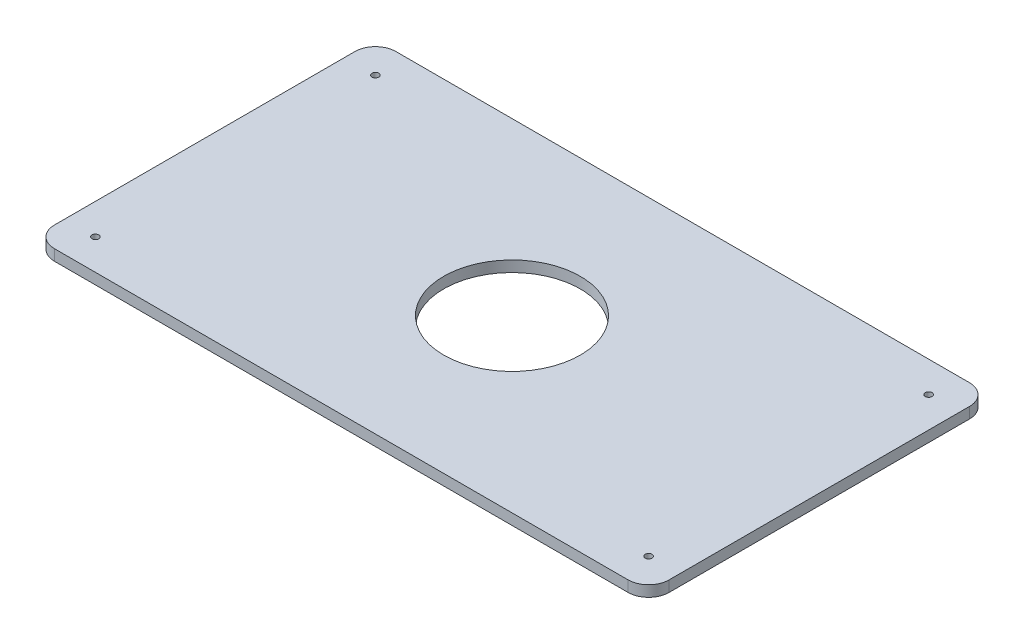
ISO-10303-21;
HEADER;
FILE_DESCRIPTION(('STEP AP214'),'2;1');
FILE_NAME('part.step','',(''),(''),'','','');
FILE_SCHEMA(('AUTOMOTIVE_DESIGN { 1 0 10303 214 1 1 1 1 }'));
ENDSEC;
DATA;
#1=APPLICATION_CONTEXT('core data for automotive mechanical design processes');
#2=APPLICATION_PROTOCOL_DEFINITION('international standard','automotive_design',2000,#1);
#3=PRODUCT_CONTEXT('',#1,'mechanical');
#4=PRODUCT('Part','Part','',(#3));
#5=PRODUCT_RELATED_PRODUCT_CATEGORY('part','',(#4));
#6=PRODUCT_DEFINITION_FORMATION('','',#4);
#7=PRODUCT_DEFINITION_CONTEXT('part definition',#1,'design');
#8=PRODUCT_DEFINITION('design','',#6,#7);
#9=PRODUCT_DEFINITION_SHAPE('','',#8);
#10=(LENGTH_UNIT() NAMED_UNIT(*) SI_UNIT(.MILLI.,.METRE.));
#11=(NAMED_UNIT(*) PLANE_ANGLE_UNIT() SI_UNIT($,.RADIAN.));
#12=(NAMED_UNIT(*) SI_UNIT($,.STERADIAN.) SOLID_ANGLE_UNIT());
#13=UNCERTAINTY_MEASURE_WITH_UNIT(LENGTH_MEASURE(1.E-05),#10,'distance_accuracy_value','');
#14=(GEOMETRIC_REPRESENTATION_CONTEXT(3) GLOBAL_UNCERTAINTY_ASSIGNED_CONTEXT((#13)) GLOBAL_UNIT_ASSIGNED_CONTEXT((#10,
#11,#12)) REPRESENTATION_CONTEXT('',''));
#15=CARTESIAN_POINT('',(0.,0.,0.));
#16=DIRECTION('',(0.,0.,1.));
#17=DIRECTION('',(1.,0.,0.));
#18=AXIS2_PLACEMENT_3D('',#15,#16,#17);
#19=CARTESIAN_POINT('',(15.,8.,-15.));
#20=DIRECTION('',(0.,-1.,0.));
#21=DIRECTION('',(0.,0.,-1.));
#22=AXIS2_PLACEMENT_3D('',#19,#20,#21);
#23=PLANE('',#22);
#24=CARTESIAN_POINT('',(15.,8.,-15.));
#25=DIRECTION('',(0.,1.,0.));
#26=DIRECTION('',(0.,0.,-1.));
#27=AXIS2_PLACEMENT_3D('',#24,#25,#26);
#28=CIRCLE('',#27,15.);
#29=CARTESIAN_POINT('',(0.,8.,-15.0000000000001));
#30=VERTEX_POINT('',#29);
#31=CARTESIAN_POINT('',(15.0000000000001,8.,0.));
#32=VERTEX_POINT('',#31);
#33=EDGE_CURVE('E145',#30,#32,#28,.T.);
#34=ORIENTED_EDGE('',*,*,#33,.T.);
#35=DIRECTION('',(1.,0.,0.));
#36=VECTOR('',#35,1.);
#37=CARTESIAN_POINT('',(15.0000000000001,8.,0.));
#38=LINE('',#37,#36);
#39=CARTESIAN_POINT('',(435.,8.,0.));
#40=VERTEX_POINT('',#39);
#41=EDGE_CURVE('E93',#32,#40,#38,.T.);
#42=ORIENTED_EDGE('',*,*,#41,.T.);
#43=CARTESIAN_POINT('',(435.,8.,-15.));
#44=DIRECTION('',(0.,1.,0.));
#45=DIRECTION('',(0.,0.,1.));
#46=AXIS2_PLACEMENT_3D('',#43,#44,#45);
#47=CIRCLE('',#46,15.);
#48=CARTESIAN_POINT('',(450.,8.,-15.0000000000001));
#49=VERTEX_POINT('',#48);
#50=EDGE_CURVE('E160',#40,#49,#47,.T.);
#51=ORIENTED_EDGE('',*,*,#50,.T.);
#52=DIRECTION('',(0.,0.,-1.));
#53=VECTOR('',#52,1.);
#54=CARTESIAN_POINT('',(450.,8.,-15.0000000000001));
#55=LINE('',#54,#53);
#56=CARTESIAN_POINT('',(450.,8.,-235.));
#57=VERTEX_POINT('',#56);
#58=EDGE_CURVE('E173',#49,#57,#55,.T.);
#59=ORIENTED_EDGE('',*,*,#58,.T.);
#60=CARTESIAN_POINT('',(435.,8.,-235.));
#61=DIRECTION('',(0.,1.,0.));
#62=DIRECTION('',(0.,0.,-1.));
#63=AXIS2_PLACEMENT_3D('',#60,#61,#62);
#64=CIRCLE('',#63,15.);
#65=CARTESIAN_POINT('',(435.,8.,-250.));
#66=VERTEX_POINT('',#65);
#67=EDGE_CURVE('E112',#57,#66,#64,.T.);
#68=ORIENTED_EDGE('',*,*,#67,.T.);
#69=DIRECTION('',(-1.,0.,0.));
#70=VECTOR('',#69,1.);
#71=CARTESIAN_POINT('',(15.0000000000001,8.,-250.));
#72=LINE('',#71,#70);
#73=CARTESIAN_POINT('',(15.0000000000001,8.,-250.));
#74=VERTEX_POINT('',#73);
#75=EDGE_CURVE('E106',#66,#74,#72,.T.);
#76=ORIENTED_EDGE('',*,*,#75,.T.);
#77=CARTESIAN_POINT('',(15.,8.,-235.));
#78=DIRECTION('',(0.,1.,0.));
#79=DIRECTION('',(0.,0.,-1.));
#80=AXIS2_PLACEMENT_3D('',#77,#78,#79);
#81=CIRCLE('',#80,15.);
#82=CARTESIAN_POINT('',(0.,8.,-235.));
#83=VERTEX_POINT('',#82);
#84=EDGE_CURVE('E110',#74,#83,#81,.T.);
#85=ORIENTED_EDGE('',*,*,#84,.T.);
#86=DIRECTION('',(0.,0.,1.));
#87=VECTOR('',#86,1.);
#88=CARTESIAN_POINT('',(0.,8.,-15.0000000000001));
#89=LINE('',#88,#87);
#90=EDGE_CURVE('E50',#83,#30,#89,.T.);
#91=ORIENTED_EDGE('',*,*,#90,.T.);
#92=EDGE_LOOP('',(#34,#42,#51,#59,#68,#76,#85,#91));
#93=FACE_BOUND('',#92,.T.);
#94=CARTESIAN_POINT('',(225.,8.,-125.));
#95=DIRECTION('',(0.,1.,0.));
#96=DIRECTION('',(0.,0.,1.));
#97=AXIS2_PLACEMENT_3D('',#94,#95,#96);
#98=CIRCLE('',#97,50.);
#99=CARTESIAN_POINT('',(225.,8.,-75.));
#100=VERTEX_POINT('',#99);
#101=EDGE_CURVE('E134',#100,#100,#98,.T.);
#102=ORIENTED_EDGE('',*,*,#101,.F.);
#103=EDGE_LOOP('',(#102));
#104=FACE_BOUND('',#103,.T.);
#105=CARTESIAN_POINT('',(22.5000000000002,8.,-227.5));
#106=DIRECTION('',(0.,1.,0.));
#107=DIRECTION('',(0.,0.,1.));
#108=AXIS2_PLACEMENT_3D('',#105,#106,#107);
#109=CIRCLE('',#108,2.5);
#110=CARTESIAN_POINT('',(22.5000000000002,8.,-225.));
#111=VERTEX_POINT('',#110);
#112=EDGE_CURVE('E182',#111,#111,#109,.T.);
#113=ORIENTED_EDGE('',*,*,#112,.F.);
#114=EDGE_LOOP('',(#113));
#115=FACE_BOUND('',#114,.T.);
#116=CARTESIAN_POINT('',(427.5,8.,-227.5));
#117=DIRECTION('',(0.,1.,0.));
#118=DIRECTION('',(0.,0.,1.));
#119=AXIS2_PLACEMENT_3D('',#116,#117,#118);
#120=CIRCLE('',#119,2.50000000000002);
#121=CARTESIAN_POINT('',(427.5,8.,-225.));
#122=VERTEX_POINT('',#121);
#123=EDGE_CURVE('E188',#122,#122,#120,.T.);
#124=ORIENTED_EDGE('',*,*,#123,.F.);
#125=EDGE_LOOP('',(#124));
#126=FACE_BOUND('',#125,.T.);
#127=CARTESIAN_POINT('',(427.5,8.,-22.5));
#128=DIRECTION('',(0.,1.,0.));
#129=DIRECTION('',(0.,0.,1.));
#130=AXIS2_PLACEMENT_3D('',#127,#128,#129);
#131=CIRCLE('',#130,2.50000000000002);
#132=CARTESIAN_POINT('',(427.5,8.,-20.));
#133=VERTEX_POINT('',#132);
#134=EDGE_CURVE('E194',#133,#133,#131,.T.);
#135=ORIENTED_EDGE('',*,*,#134,.F.);
#136=EDGE_LOOP('',(#135));
#137=FACE_BOUND('',#136,.T.);
#138=CARTESIAN_POINT('',(22.5000000000002,8.,-22.5));
#139=DIRECTION('',(0.,1.,0.));
#140=DIRECTION('',(0.,0.,1.));
#141=AXIS2_PLACEMENT_3D('',#138,#139,#140);
#142=CIRCLE('',#141,2.5);
#143=CARTESIAN_POINT('',(22.5000000000002,8.,-20.));
#144=VERTEX_POINT('',#143);
#145=EDGE_CURVE('E200',#144,#144,#142,.T.);
#146=ORIENTED_EDGE('',*,*,#145,.F.);
#147=EDGE_LOOP('',(#146));
#148=FACE_BOUND('',#147,.T.);
#149=ADVANCED_FACE('F33',(#93,#104,#115,#126,#137,#148),#23,.F.);
#150=CARTESIAN_POINT('',(15.,0.,-15.));
#151=DIRECTION('',(0.,-1.,0.));
#152=DIRECTION('',(0.,0.,-1.));
#153=AXIS2_PLACEMENT_3D('',#150,#151,#152);
#154=PLANE('',#153);
#155=CARTESIAN_POINT('',(427.5,0.,-22.5));
#156=DIRECTION('',(0.,1.,0.));
#157=DIRECTION('',(0.,0.,1.));
#158=AXIS2_PLACEMENT_3D('',#155,#156,#157);
#159=CIRCLE('',#158,2.50000000000002);
#160=CARTESIAN_POINT('',(427.5,0.,-20.));
#161=VERTEX_POINT('',#160);
#162=EDGE_CURVE('E197',#161,#161,#159,.T.);
#163=ORIENTED_EDGE('',*,*,#162,.T.);
#164=EDGE_LOOP('',(#163));
#165=FACE_BOUND('',#164,.T.);
#166=CARTESIAN_POINT('',(22.5000000000002,0.,-227.5));
#167=DIRECTION('',(0.,1.,0.));
#168=DIRECTION('',(0.,0.,1.));
#169=AXIS2_PLACEMENT_3D('',#166,#167,#168);
#170=CIRCLE('',#169,2.5);
#171=CARTESIAN_POINT('',(22.5000000000002,0.,-225.));
#172=VERTEX_POINT('',#171);
#173=EDGE_CURVE('E185',#172,#172,#170,.T.);
#174=ORIENTED_EDGE('',*,*,#173,.T.);
#175=EDGE_LOOP('',(#174));
#176=FACE_BOUND('',#175,.T.);
#177=CARTESIAN_POINT('',(15.,0.,-15.));
#178=DIRECTION('',(0.,1.,0.));
#179=DIRECTION('',(0.,0.,-1.));
#180=AXIS2_PLACEMENT_3D('',#177,#178,#179);
#181=CIRCLE('',#180,15.);
#182=CARTESIAN_POINT('',(0.,0.,-15.0000000000001));
#183=VERTEX_POINT('',#182);
#184=CARTESIAN_POINT('',(15.0000000000001,0.,0.));
#185=VERTEX_POINT('',#184);
#186=EDGE_CURVE('E130',#183,#185,#181,.T.);
#187=ORIENTED_EDGE('',*,*,#186,.F.);
#188=DIRECTION('',(0.,0.,1.));
#189=VECTOR('',#188,1.);
#190=CARTESIAN_POINT('',(0.,0.,-15.0000000000001));
#191=LINE('',#190,#189);
#192=CARTESIAN_POINT('',(0.,0.,-235.));
#193=VERTEX_POINT('',#192);
#194=EDGE_CURVE('E85',#193,#183,#191,.T.);
#195=ORIENTED_EDGE('',*,*,#194,.F.);
#196=CARTESIAN_POINT('',(15.,0.,-235.));
#197=DIRECTION('',(0.,1.,0.));
#198=DIRECTION('',(0.,0.,-1.));
#199=AXIS2_PLACEMENT_3D('',#196,#197,#198);
#200=CIRCLE('',#199,15.);
#201=CARTESIAN_POINT('',(15.0000000000001,0.,-250.));
#202=VERTEX_POINT('',#201);
#203=EDGE_CURVE('E79',#202,#193,#200,.T.);
#204=ORIENTED_EDGE('',*,*,#203,.F.);
#205=DIRECTION('',(-1.,0.,0.));
#206=VECTOR('',#205,1.);
#207=CARTESIAN_POINT('',(15.0000000000001,0.,-250.));
#208=LINE('',#207,#206);
#209=CARTESIAN_POINT('',(435.,0.,-250.));
#210=VERTEX_POINT('',#209);
#211=EDGE_CURVE('E120',#210,#202,#208,.T.);
#212=ORIENTED_EDGE('',*,*,#211,.F.);
#213=CARTESIAN_POINT('',(435.,0.,-235.));
#214=DIRECTION('',(0.,1.,0.));
#215=DIRECTION('',(0.,0.,-1.));
#216=AXIS2_PLACEMENT_3D('',#213,#214,#215);
#217=CIRCLE('',#216,15.);
#218=CARTESIAN_POINT('',(450.,0.,-235.));
#219=VERTEX_POINT('',#218);
#220=EDGE_CURVE('E140',#219,#210,#217,.T.);
#221=ORIENTED_EDGE('',*,*,#220,.F.);
#222=DIRECTION('',(0.,0.,-1.));
#223=VECTOR('',#222,1.);
#224=CARTESIAN_POINT('',(450.,0.,-15.0000000000001));
#225=LINE('',#224,#223);
#226=CARTESIAN_POINT('',(450.,0.,-15.0000000000001));
#227=VERTEX_POINT('',#226);
#228=EDGE_CURVE('E138',#227,#219,#225,.T.);
#229=ORIENTED_EDGE('',*,*,#228,.F.);
#230=CARTESIAN_POINT('',(435.,0.,-15.));
#231=DIRECTION('',(0.,1.,0.));
#232=DIRECTION('',(0.,0.,1.));
#233=AXIS2_PLACEMENT_3D('',#230,#231,#232);
#234=CIRCLE('',#233,15.);
#235=CARTESIAN_POINT('',(435.,0.,0.));
#236=VERTEX_POINT('',#235);
#237=EDGE_CURVE('E136',#236,#227,#234,.T.);
#238=ORIENTED_EDGE('',*,*,#237,.F.);
#239=DIRECTION('',(1.,0.,0.));
#240=VECTOR('',#239,1.);
#241=CARTESIAN_POINT('',(15.0000000000001,0.,0.));
#242=LINE('',#241,#240);
#243=EDGE_CURVE('E133',#185,#236,#242,.T.);
#244=ORIENTED_EDGE('',*,*,#243,.F.);
#245=EDGE_LOOP('',(#187,#195,#204,#212,#221,#229,#238,#244));
#246=FACE_BOUND('',#245,.T.);
#247=CARTESIAN_POINT('',(225.,0.,-125.));
#248=DIRECTION('',(0.,1.,0.));
#249=DIRECTION('',(0.,0.,1.));
#250=AXIS2_PLACEMENT_3D('',#247,#248,#249);
#251=CIRCLE('',#250,50.);
#252=CARTESIAN_POINT('',(225.,0.,-75.));
#253=VERTEX_POINT('',#252);
#254=EDGE_CURVE('E179',#253,#253,#251,.T.);
#255=ORIENTED_EDGE('',*,*,#254,.T.);
#256=EDGE_LOOP('',(#255));
#257=FACE_BOUND('',#256,.T.);
#258=CARTESIAN_POINT('',(427.5,0.,-227.5));
#259=DIRECTION('',(0.,1.,0.));
#260=DIRECTION('',(0.,0.,1.));
#261=AXIS2_PLACEMENT_3D('',#258,#259,#260);
#262=CIRCLE('',#261,2.50000000000002);
#263=CARTESIAN_POINT('',(427.5,0.,-225.));
#264=VERTEX_POINT('',#263);
#265=EDGE_CURVE('E191',#264,#264,#262,.T.);
#266=ORIENTED_EDGE('',*,*,#265,.T.);
#267=EDGE_LOOP('',(#266));
#268=FACE_BOUND('',#267,.T.);
#269=CARTESIAN_POINT('',(22.5000000000002,0.,-22.5));
#270=DIRECTION('',(0.,1.,0.));
#271=DIRECTION('',(0.,0.,1.));
#272=AXIS2_PLACEMENT_3D('',#269,#270,#271);
#273=CIRCLE('',#272,2.5);
#274=CARTESIAN_POINT('',(22.5000000000002,0.,-20.));
#275=VERTEX_POINT('',#274);
#276=EDGE_CURVE('E203',#275,#275,#273,.T.);
#277=ORIENTED_EDGE('',*,*,#276,.T.);
#278=EDGE_LOOP('',(#277));
#279=FACE_BOUND('',#278,.T.);
#280=ADVANCED_FACE('F164',(#165,#176,#246,#257,#268,#279),#154,.T.);
#281=CARTESIAN_POINT('',(15.,8.,-15.));
#282=DIRECTION('',(0.,-1.,0.));
#283=DIRECTION('',(0.,0.,-1.));
#284=AXIS2_PLACEMENT_3D('',#281,#282,#283);
#285=CYLINDRICAL_SURFACE('',#284,15.);
#286=ORIENTED_EDGE('',*,*,#186,.T.);
#287=DIRECTION('',(0.,-1.,0.));
#288=VECTOR('',#287,1.);
#289=CARTESIAN_POINT('',(15.0000000000001,8.,0.));
#290=LINE('',#289,#288);
#291=EDGE_CURVE('E11',#32,#185,#290,.T.);
#292=ORIENTED_EDGE('',*,*,#291,.F.);
#293=ORIENTED_EDGE('',*,*,#33,.F.);
#294=DIRECTION('',(0.,-1.,0.));
#295=VECTOR('',#294,1.);
#296=CARTESIAN_POINT('',(0.,8.,-15.0000000000001));
#297=LINE('',#296,#295);
#298=EDGE_CURVE('E126',#30,#183,#297,.T.);
#299=ORIENTED_EDGE('',*,*,#298,.T.);
#300=EDGE_LOOP('',(#286,#292,#293,#299));
#301=FACE_BOUND('',#300,.T.);
#302=ADVANCED_FACE('F35',(#301),#285,.T.);
#303=CARTESIAN_POINT('',(15.0000000000001,8.,0.));
#304=DIRECTION('',(0.,0.,-1.));
#305=DIRECTION('',(-1.,0.,0.));
#306=AXIS2_PLACEMENT_3D('',#303,#304,#305);
#307=PLANE('',#306);
#308=ORIENTED_EDGE('',*,*,#243,.T.);
#309=DIRECTION('',(0.,-1.,0.));
#310=VECTOR('',#309,1.);
#311=CARTESIAN_POINT('',(435.,8.,0.));
#312=LINE('',#311,#310);
#313=EDGE_CURVE('E42',#40,#236,#312,.T.);
#314=ORIENTED_EDGE('',*,*,#313,.F.);
#315=ORIENTED_EDGE('',*,*,#41,.F.);
#316=ORIENTED_EDGE('',*,*,#291,.T.);
#317=EDGE_LOOP('',(#308,#314,#315,#316));
#318=FACE_BOUND('',#317,.T.);
#319=ADVANCED_FACE('F235',(#318),#307,.F.);
#320=CARTESIAN_POINT('',(435.,8.,-15.));
#321=DIRECTION('',(0.,-1.,0.));
#322=DIRECTION('',(0.,0.,-1.));
#323=AXIS2_PLACEMENT_3D('',#320,#321,#322);
#324=CYLINDRICAL_SURFACE('',#323,15.);
#325=ORIENTED_EDGE('',*,*,#237,.T.);
#326=DIRECTION('',(0.,-1.,0.));
#327=VECTOR('',#326,1.);
#328=CARTESIAN_POINT('',(450.,8.,-15.0000000000001));
#329=LINE('',#328,#327);
#330=EDGE_CURVE('E152',#49,#227,#329,.T.);
#331=ORIENTED_EDGE('',*,*,#330,.F.);
#332=ORIENTED_EDGE('',*,*,#50,.F.);
#333=ORIENTED_EDGE('',*,*,#313,.T.);
#334=EDGE_LOOP('',(#325,#331,#332,#333));
#335=FACE_BOUND('',#334,.T.);
#336=ADVANCED_FACE('F158',(#335),#324,.T.);
#337=CARTESIAN_POINT('',(450.,8.,-15.0000000000001));
#338=DIRECTION('',(-1.,0.,0.));
#339=DIRECTION('',(0.,0.,1.));
#340=AXIS2_PLACEMENT_3D('',#337,#338,#339);
#341=PLANE('',#340);
#342=ORIENTED_EDGE('',*,*,#228,.T.);
#343=DIRECTION('',(0.,-1.,0.));
#344=VECTOR('',#343,1.);
#345=CARTESIAN_POINT('',(450.,8.,-235.));
#346=LINE('',#345,#344);
#347=EDGE_CURVE('E149',#57,#219,#346,.T.);
#348=ORIENTED_EDGE('',*,*,#347,.F.);
#349=ORIENTED_EDGE('',*,*,#58,.F.);
#350=ORIENTED_EDGE('',*,*,#330,.T.);
#351=EDGE_LOOP('',(#342,#348,#349,#350));
#352=FACE_BOUND('',#351,.T.);
#353=ADVANCED_FACE('F169',(#352),#341,.F.);
#354=CARTESIAN_POINT('',(435.,8.,-235.));
#355=DIRECTION('',(0.,-1.,0.));
#356=DIRECTION('',(0.,0.,-1.));
#357=AXIS2_PLACEMENT_3D('',#354,#355,#356);
#358=CYLINDRICAL_SURFACE('',#357,15.);
#359=ORIENTED_EDGE('',*,*,#220,.T.);
#360=DIRECTION('',(0.,-1.,0.));
#361=VECTOR('',#360,1.);
#362=CARTESIAN_POINT('',(435.,8.,-250.));
#363=LINE('',#362,#361);
#364=EDGE_CURVE('E121',#66,#210,#363,.T.);
#365=ORIENTED_EDGE('',*,*,#364,.F.);
#366=ORIENTED_EDGE('',*,*,#67,.F.);
#367=ORIENTED_EDGE('',*,*,#347,.T.);
#368=EDGE_LOOP('',(#359,#365,#366,#367));
#369=FACE_BOUND('',#368,.T.);
#370=ADVANCED_FACE('F172',(#369),#358,.T.);
#371=CARTESIAN_POINT('',(15.0000000000001,8.,-250.));
#372=DIRECTION('',(0.,0.,1.));
#373=DIRECTION('',(1.,0.,0.));
#374=AXIS2_PLACEMENT_3D('',#371,#372,#373);
#375=PLANE('',#374);
#376=ORIENTED_EDGE('',*,*,#211,.T.);
#377=DIRECTION('',(0.,-1.,0.));
#378=VECTOR('',#377,1.);
#379=CARTESIAN_POINT('',(15.0000000000001,8.,-250.));
#380=LINE('',#379,#378);
#381=EDGE_CURVE('E117',#74,#202,#380,.T.);
#382=ORIENTED_EDGE('',*,*,#381,.F.);
#383=ORIENTED_EDGE('',*,*,#75,.F.);
#384=ORIENTED_EDGE('',*,*,#364,.T.);
#385=EDGE_LOOP('',(#376,#382,#383,#384));
#386=FACE_BOUND('',#385,.T.);
#387=ADVANCED_FACE('F118',(#386),#375,.F.);
#388=CARTESIAN_POINT('',(15.,8.,-235.));
#389=DIRECTION('',(0.,-1.,0.));
#390=DIRECTION('',(0.,0.,-1.));
#391=AXIS2_PLACEMENT_3D('',#388,#389,#390);
#392=CYLINDRICAL_SURFACE('',#391,15.);
#393=ORIENTED_EDGE('',*,*,#203,.T.);
#394=DIRECTION('',(0.,-1.,0.));
#395=VECTOR('',#394,1.);
#396=CARTESIAN_POINT('',(0.,8.,-235.));
#397=LINE('',#396,#395);
#398=EDGE_CURVE('E122',#83,#193,#397,.T.);
#399=ORIENTED_EDGE('',*,*,#398,.F.);
#400=ORIENTED_EDGE('',*,*,#84,.F.);
#401=ORIENTED_EDGE('',*,*,#381,.T.);
#402=EDGE_LOOP('',(#393,#399,#400,#401));
#403=FACE_BOUND('',#402,.T.);
#404=ADVANCED_FACE('F124',(#403),#392,.T.);
#405=CARTESIAN_POINT('',(0.,8.,-15.0000000000001));
#406=DIRECTION('',(1.,0.,0.));
#407=DIRECTION('',(0.,0.,-1.));
#408=AXIS2_PLACEMENT_3D('',#405,#406,#407);
#409=PLANE('',#408);
#410=ORIENTED_EDGE('',*,*,#194,.T.);
#411=ORIENTED_EDGE('',*,*,#298,.F.);
#412=ORIENTED_EDGE('',*,*,#90,.F.);
#413=ORIENTED_EDGE('',*,*,#398,.T.);
#414=EDGE_LOOP('',(#410,#411,#412,#413));
#415=FACE_BOUND('',#414,.T.);
#416=ADVANCED_FACE('F223',(#415),#409,.F.);
#417=CARTESIAN_POINT('',(225.,8.,-125.));
#418=DIRECTION('',(0.,-1.,0.));
#419=DIRECTION('',(0.,0.,-1.));
#420=AXIS2_PLACEMENT_3D('',#417,#418,#419);
#421=CYLINDRICAL_SURFACE('',#420,50.);
#422=ORIENTED_EDGE('',*,*,#101,.T.);
#423=EDGE_LOOP('',(#422));
#424=FACE_BOUND('',#423,.T.);
#425=ORIENTED_EDGE('',*,*,#254,.F.);
#426=EDGE_LOOP('',(#425));
#427=FACE_BOUND('',#426,.T.);
#428=ADVANCED_FACE('F220',(#424,#427),#421,.F.);
#429=CARTESIAN_POINT('',(22.5000000000002,8.,-227.5));
#430=DIRECTION('',(0.,-1.,0.));
#431=DIRECTION('',(0.,0.,-1.));
#432=AXIS2_PLACEMENT_3D('',#429,#430,#431);
#433=CYLINDRICAL_SURFACE('',#432,2.5);
#434=ORIENTED_EDGE('',*,*,#112,.T.);
#435=EDGE_LOOP('',(#434));
#436=FACE_BOUND('',#435,.T.);
#437=ORIENTED_EDGE('',*,*,#173,.F.);
#438=EDGE_LOOP('',(#437));
#439=FACE_BOUND('',#438,.T.);
#440=ADVANCED_FACE('F299',(#436,#439),#433,.F.);
#441=CARTESIAN_POINT('',(427.5,8.,-227.5));
#442=DIRECTION('',(0.,-1.,0.));
#443=DIRECTION('',(0.,0.,-1.));
#444=AXIS2_PLACEMENT_3D('',#441,#442,#443);
#445=CYLINDRICAL_SURFACE('',#444,2.50000000000002);
#446=ORIENTED_EDGE('',*,*,#123,.T.);
#447=EDGE_LOOP('',(#446));
#448=FACE_BOUND('',#447,.T.);
#449=ORIENTED_EDGE('',*,*,#265,.F.);
#450=EDGE_LOOP('',(#449));
#451=FACE_BOUND('',#450,.T.);
#452=ADVANCED_FACE('F307',(#448,#451),#445,.F.);
#453=CARTESIAN_POINT('',(427.5,8.,-22.5));
#454=DIRECTION('',(0.,-1.,0.));
#455=DIRECTION('',(0.,0.,-1.));
#456=AXIS2_PLACEMENT_3D('',#453,#454,#455);
#457=CYLINDRICAL_SURFACE('',#456,2.50000000000002);
#458=ORIENTED_EDGE('',*,*,#134,.T.);
#459=EDGE_LOOP('',(#458));
#460=FACE_BOUND('',#459,.T.);
#461=ORIENTED_EDGE('',*,*,#162,.F.);
#462=EDGE_LOOP('',(#461));
#463=FACE_BOUND('',#462,.T.);
#464=ADVANCED_FACE('F315',(#460,#463),#457,.F.);
#465=CARTESIAN_POINT('',(22.5000000000002,8.,-22.5));
#466=DIRECTION('',(0.,-1.,0.));
#467=DIRECTION('',(0.,0.,-1.));
#468=AXIS2_PLACEMENT_3D('',#465,#466,#467);
#469=CYLINDRICAL_SURFACE('',#468,2.5);
#470=ORIENTED_EDGE('',*,*,#145,.T.);
#471=EDGE_LOOP('',(#470));
#472=FACE_BOUND('',#471,.T.);
#473=ORIENTED_EDGE('',*,*,#276,.F.);
#474=EDGE_LOOP('',(#473));
#475=FACE_BOUND('',#474,.T.);
#476=ADVANCED_FACE('F209',(#472,#475),#469,.F.);
#477=CLOSED_SHELL('',(#149,#280,#302,#319,#336,#353,#370,#387,#404,#416,#428,#440,#452,#464,#476));
#478=MANIFOLD_SOLID_BREP('B2',#477);
#479=ADVANCED_BREP_SHAPE_REPRESENTATION('',(#18,#478),#14);
#480=SHAPE_DEFINITION_REPRESENTATION(#9,#479);
ENDSEC;
END-ISO-10303-21;
